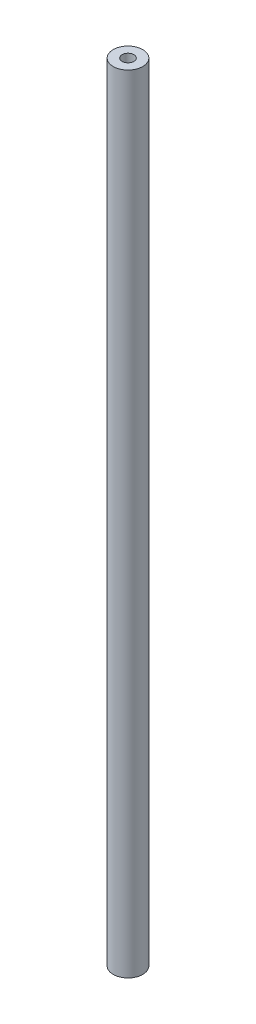
ISO-10303-21;
HEADER;
FILE_DESCRIPTION(('STEP AP214'),'2;1');
FILE_NAME('part.step','',(''),(''),'','','');
FILE_SCHEMA(('AUTOMOTIVE_DESIGN { 1 0 10303 214 1 1 1 1 }'));
ENDSEC;
DATA;
#1=APPLICATION_CONTEXT('core data for automotive mechanical design processes');
#2=APPLICATION_PROTOCOL_DEFINITION('international standard','automotive_design',2000,#1);
#3=PRODUCT_CONTEXT('',#1,'mechanical');
#4=PRODUCT('Part','Part','',(#3));
#5=PRODUCT_RELATED_PRODUCT_CATEGORY('part','',(#4));
#6=PRODUCT_DEFINITION_FORMATION('','',#4);
#7=PRODUCT_DEFINITION_CONTEXT('part definition',#1,'design');
#8=PRODUCT_DEFINITION('design','',#6,#7);
#9=PRODUCT_DEFINITION_SHAPE('','',#8);
#10=(LENGTH_UNIT() NAMED_UNIT(*) SI_UNIT(.MILLI.,.METRE.));
#11=(NAMED_UNIT(*) PLANE_ANGLE_UNIT() SI_UNIT($,.RADIAN.));
#12=(NAMED_UNIT(*) SI_UNIT($,.STERADIAN.) SOLID_ANGLE_UNIT());
#13=UNCERTAINTY_MEASURE_WITH_UNIT(LENGTH_MEASURE(1.E-05),#10,'distance_accuracy_value','');
#14=(GEOMETRIC_REPRESENTATION_CONTEXT(3) GLOBAL_UNCERTAINTY_ASSIGNED_CONTEXT((#13)) GLOBAL_UNIT_ASSIGNED_CONTEXT((#10,
#11,#12)) REPRESENTATION_CONTEXT('',''));
#15=CARTESIAN_POINT('',(0.,0.,0.));
#16=DIRECTION('',(0.,0.,1.));
#17=DIRECTION('',(1.,0.,0.));
#18=AXIS2_PLACEMENT_3D('',#15,#16,#17);
#19=CARTESIAN_POINT('',(0.,400.,0.));
#20=DIRECTION('',(0.,-1.,0.));
#21=DIRECTION('',(0.,0.,-1.));
#22=AXIS2_PLACEMENT_3D('',#19,#20,#21);
#23=CYLINDRICAL_SURFACE('',#22,7.5);
#24=CARTESIAN_POINT('',(0.,400.,0.));
#25=DIRECTION('',(0.,1.,0.));
#26=DIRECTION('',(0.,0.,1.));
#27=AXIS2_PLACEMENT_3D('',#24,#25,#26);
#28=CIRCLE('',#27,7.5);
#29=CARTESIAN_POINT('',(0.,400.,7.5));
#30=VERTEX_POINT('',#29);
#31=EDGE_CURVE('E10',#30,#30,#28,.T.);
#32=ORIENTED_EDGE('',*,*,#31,.F.);
#33=EDGE_LOOP('',(#32));
#34=FACE_BOUND('',#33,.T.);
#35=CARTESIAN_POINT('',(0.,0.,0.));
#36=DIRECTION('',(0.,1.,0.));
#37=DIRECTION('',(0.,0.,1.));
#38=AXIS2_PLACEMENT_3D('',#35,#36,#37);
#39=CIRCLE('',#38,7.5);
#40=CARTESIAN_POINT('',(0.,0.,7.5));
#41=VERTEX_POINT('',#40);
#42=EDGE_CURVE('E37',#41,#41,#39,.T.);
#43=ORIENTED_EDGE('',*,*,#42,.T.);
#44=EDGE_LOOP('',(#43));
#45=FACE_BOUND('',#44,.T.);
#46=ADVANCED_FACE('F34',(#34,#45),#23,.T.);
#47=CARTESIAN_POINT('',(0.,400.,0.));
#48=DIRECTION('',(0.,1.,0.));
#49=DIRECTION('',(0.,0.,1.));
#50=AXIS2_PLACEMENT_3D('',#47,#48,#49);
#51=PLANE('',#50);
#52=CARTESIAN_POINT('',(0.,400.,0.));
#53=DIRECTION('',(0.,1.,0.));
#54=DIRECTION('',(0.,0.,1.));
#55=AXIS2_PLACEMENT_3D('',#52,#53,#54);
#56=CIRCLE('',#55,3.);
#57=CARTESIAN_POINT('',(0.,400.,3.));
#58=VERTEX_POINT('',#57);
#59=EDGE_CURVE('E46',#58,#58,#56,.T.);
#60=ORIENTED_EDGE('',*,*,#59,.F.);
#61=EDGE_LOOP('',(#60));
#62=FACE_BOUND('',#61,.T.);
#63=ORIENTED_EDGE('',*,*,#31,.T.);
#64=EDGE_LOOP('',(#63));
#65=FACE_BOUND('',#64,.T.);
#66=ADVANCED_FACE('F71',(#62,#65),#51,.T.);
#67=CARTESIAN_POINT('',(0.,0.,0.));
#68=DIRECTION('',(0.,1.,0.));
#69=DIRECTION('',(0.,0.,1.));
#70=AXIS2_PLACEMENT_3D('',#67,#68,#69);
#71=PLANE('',#70);
#72=CARTESIAN_POINT('',(0.,0.,0.));
#73=DIRECTION('',(0.,-1.,0.));
#74=DIRECTION('',(0.,0.,-1.));
#75=AXIS2_PLACEMENT_3D('',#72,#73,#74);
#76=CIRCLE('',#75,3.);
#77=CARTESIAN_POINT('',(0.,0.,-3.));
#78=VERTEX_POINT('',#77);
#79=EDGE_CURVE('E52',#78,#78,#76,.T.);
#80=ORIENTED_EDGE('',*,*,#79,.F.);
#81=EDGE_LOOP('',(#80));
#82=FACE_BOUND('',#81,.T.);
#83=ORIENTED_EDGE('',*,*,#42,.F.);
#84=EDGE_LOOP('',(#83));
#85=FACE_BOUND('',#84,.T.);
#86=ADVANCED_FACE('F67',(#82,#85),#71,.F.);
#87=CARTESIAN_POINT('',(0.,380.,0.));
#88=DIRECTION('',(0.,1.,0.));
#89=DIRECTION('',(0.,0.,1.));
#90=AXIS2_PLACEMENT_3D('',#87,#88,#89);
#91=CYLINDRICAL_SURFACE('',#90,3.);
#92=CARTESIAN_POINT('',(0.,380.,0.));
#93=DIRECTION('',(0.,1.,0.));
#94=DIRECTION('',(0.,0.,1.));
#95=AXIS2_PLACEMENT_3D('',#92,#93,#94);
#96=CIRCLE('',#95,3.);
#97=CARTESIAN_POINT('',(0.,380.,3.));
#98=VERTEX_POINT('',#97);
#99=EDGE_CURVE('E44',#98,#98,#96,.T.);
#100=ORIENTED_EDGE('',*,*,#99,.F.);
#101=EDGE_LOOP('',(#100));
#102=FACE_BOUND('',#101,.T.);
#103=ORIENTED_EDGE('',*,*,#59,.T.);
#104=EDGE_LOOP('',(#103));
#105=FACE_BOUND('',#104,.T.);
#106=ADVANCED_FACE('F70',(#102,#105),#91,.F.);
#107=CARTESIAN_POINT('',(0.,380.,0.));
#108=DIRECTION('',(0.,1.,0.));
#109=DIRECTION('',(0.,0.,1.));
#110=AXIS2_PLACEMENT_3D('',#107,#108,#109);
#111=PLANE('',#110);
#112=ORIENTED_EDGE('',*,*,#99,.T.);
#113=EDGE_LOOP('',(#112));
#114=FACE_BOUND('',#113,.T.);
#115=ADVANCED_FACE('F63',(#114),#111,.T.);
#116=CARTESIAN_POINT('',(0.,20.,0.));
#117=DIRECTION('',(0.,-1.,0.));
#118=DIRECTION('',(0.,0.,-1.));
#119=AXIS2_PLACEMENT_3D('',#116,#117,#118);
#120=CYLINDRICAL_SURFACE('',#119,3.);
#121=CARTESIAN_POINT('',(0.,20.,0.));
#122=DIRECTION('',(0.,-1.,0.));
#123=DIRECTION('',(0.,0.,-1.));
#124=AXIS2_PLACEMENT_3D('',#121,#122,#123);
#125=CIRCLE('',#124,3.);
#126=CARTESIAN_POINT('',(0.,20.,-3.));
#127=VERTEX_POINT('',#126);
#128=EDGE_CURVE('E49',#127,#127,#125,.T.);
#129=ORIENTED_EDGE('',*,*,#128,.F.);
#130=EDGE_LOOP('',(#129));
#131=FACE_BOUND('',#130,.T.);
#132=ORIENTED_EDGE('',*,*,#79,.T.);
#133=EDGE_LOOP('',(#132));
#134=FACE_BOUND('',#133,.T.);
#135=ADVANCED_FACE('F60',(#131,#134),#120,.F.);
#136=CARTESIAN_POINT('',(0.,20.,0.));
#137=DIRECTION('',(0.,-1.,0.));
#138=DIRECTION('',(0.,0.,-1.));
#139=AXIS2_PLACEMENT_3D('',#136,#137,#138);
#140=PLANE('',#139);
#141=ORIENTED_EDGE('',*,*,#128,.T.);
#142=EDGE_LOOP('',(#141));
#143=FACE_BOUND('',#142,.T.);
#144=ADVANCED_FACE('F58',(#143),#140,.T.);
#145=CLOSED_SHELL('',(#46,#66,#86,#106,#115,#135,#144));
#146=MANIFOLD_SOLID_BREP('B2',#145);
#147=ADVANCED_BREP_SHAPE_REPRESENTATION('',(#18,#146),#14);
#148=SHAPE_DEFINITION_REPRESENTATION(#9,#147);
ENDSEC;
END-ISO-10303-21;
